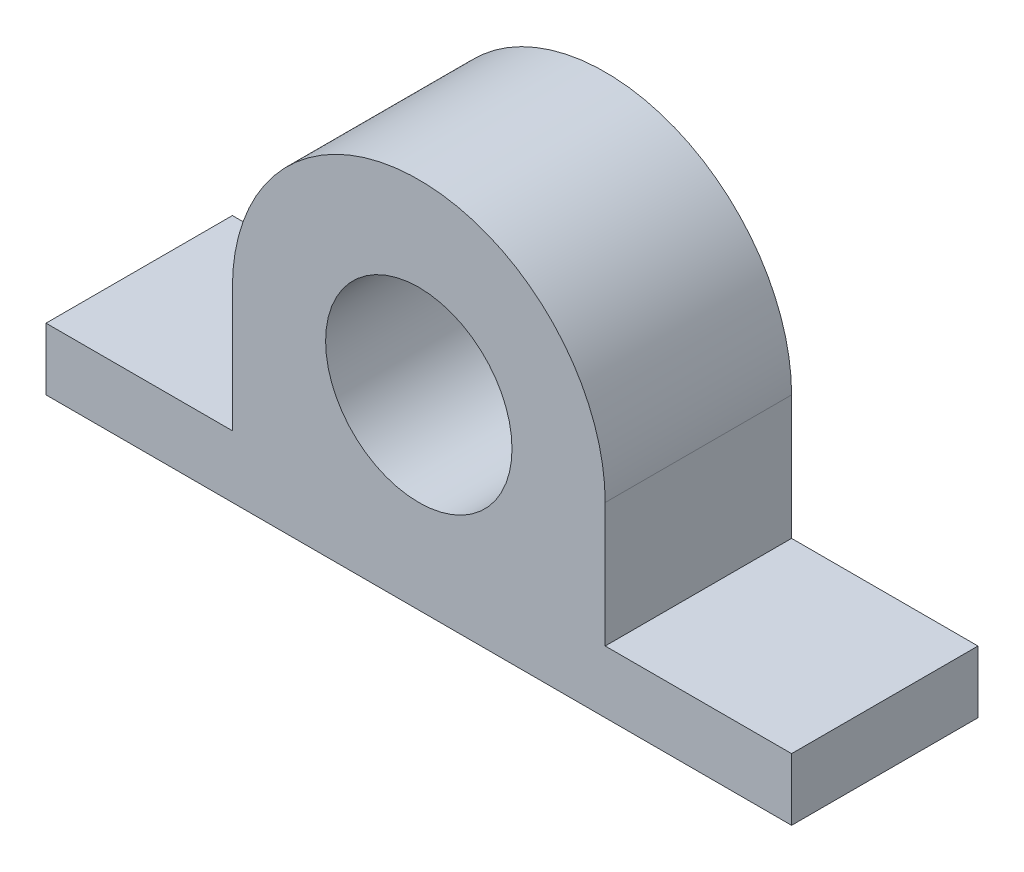
ISO-10303-21;
HEADER;
FILE_DESCRIPTION(('STEP AP214'),'2;1');
FILE_NAME('part.step','',(''),(''),'','','');
FILE_SCHEMA(('AUTOMOTIVE_DESIGN { 1 0 10303 214 1 1 1 1 }'));
ENDSEC;
DATA;
#1=APPLICATION_CONTEXT('core data for automotive mechanical design processes');
#2=APPLICATION_PROTOCOL_DEFINITION('international standard','automotive_design',2000,#1);
#3=PRODUCT_CONTEXT('',#1,'mechanical');
#4=PRODUCT('Part','Part','',(#3));
#5=PRODUCT_RELATED_PRODUCT_CATEGORY('part','',(#4));
#6=PRODUCT_DEFINITION_FORMATION('','',#4);
#7=PRODUCT_DEFINITION_CONTEXT('part definition',#1,'design');
#8=PRODUCT_DEFINITION('design','',#6,#7);
#9=PRODUCT_DEFINITION_SHAPE('','',#8);
#10=(LENGTH_UNIT() NAMED_UNIT(*) SI_UNIT(.MILLI.,.METRE.));
#11=(NAMED_UNIT(*) PLANE_ANGLE_UNIT() SI_UNIT($,.RADIAN.));
#12=(NAMED_UNIT(*) SI_UNIT($,.STERADIAN.) SOLID_ANGLE_UNIT());
#13=UNCERTAINTY_MEASURE_WITH_UNIT(LENGTH_MEASURE(1.E-05),#10,'distance_accuracy_value','');
#14=(GEOMETRIC_REPRESENTATION_CONTEXT(3) GLOBAL_UNCERTAINTY_ASSIGNED_CONTEXT((#13)) GLOBAL_UNIT_ASSIGNED_CONTEXT((#10,
#11,#12)) REPRESENTATION_CONTEXT('',''));
#15=CARTESIAN_POINT('',(0.,0.,0.));
#16=DIRECTION('',(0.,0.,1.));
#17=DIRECTION('',(1.,0.,0.));
#18=AXIS2_PLACEMENT_3D('',#15,#16,#17);
#19=CARTESIAN_POINT('',(30.,0.,30.));
#20=DIRECTION('',(1.,0.,0.));
#21=DIRECTION('',(0.,0.,-1.));
#22=AXIS2_PLACEMENT_3D('',#19,#20,#21);
#23=PLANE('',#22);
#24=DIRECTION('',(0.,-1.,0.));
#25=VECTOR('',#24,1.);
#26=CARTESIAN_POINT('',(30.,0.,0.));
#27=LINE('',#26,#25);
#28=CARTESIAN_POINT('',(30.,25.,0.));
#29=VERTEX_POINT('',#28);
#30=CARTESIAN_POINT('',(30.,5.,0.));
#31=VERTEX_POINT('',#30);
#32=EDGE_CURVE('E137',#29,#31,#27,.T.);
#33=ORIENTED_EDGE('',*,*,#32,.F.);
#34=DIRECTION('',(0.,0.,-1.));
#35=VECTOR('',#34,1.);
#36=CARTESIAN_POINT('',(30.,25.,30.));
#37=LINE('',#36,#35);
#38=CARTESIAN_POINT('',(30.,25.,30.));
#39=VERTEX_POINT('',#38);
#40=EDGE_CURVE('E11',#39,#29,#37,.T.);
#41=ORIENTED_EDGE('',*,*,#40,.F.);
#42=DIRECTION('',(0.,-1.,0.));
#43=VECTOR('',#42,1.);
#44=CARTESIAN_POINT('',(30.,0.,30.));
#45=LINE('',#44,#43);
#46=CARTESIAN_POINT('',(30.,5.,30.));
#47=VERTEX_POINT('',#46);
#48=EDGE_CURVE('E207',#39,#47,#45,.T.);
#49=ORIENTED_EDGE('',*,*,#48,.T.);
#50=DIRECTION('',(0.,0.,-1.));
#51=VECTOR('',#50,1.);
#52=CARTESIAN_POINT('',(30.,5.,30.));
#53=LINE('',#52,#51);
#54=EDGE_CURVE('E87',#47,#31,#53,.T.);
#55=ORIENTED_EDGE('',*,*,#54,.T.);
#56=EDGE_LOOP('',(#33,#41,#49,#55));
#57=FACE_BOUND('',#56,.T.);
#58=ADVANCED_FACE('F35',(#57),#23,.T.);
#59=CARTESIAN_POINT('',(0.,25.,30.));
#60=DIRECTION('',(0.,0.,-1.));
#61=DIRECTION('',(-1.,0.,0.));
#62=AXIS2_PLACEMENT_3D('',#59,#60,#61);
#63=CYLINDRICAL_SURFACE('',#62,30.);
#64=CARTESIAN_POINT('',(0.,25.,0.));
#65=DIRECTION('',(0.,0.,1.));
#66=DIRECTION('',(1.,0.,0.));
#67=AXIS2_PLACEMENT_3D('',#64,#65,#66);
#68=CIRCLE('',#67,30.);
#69=CARTESIAN_POINT('',(-30.,25.,0.));
#70=VERTEX_POINT('',#69);
#71=EDGE_CURVE('E139',#29,#70,#68,.T.);
#72=ORIENTED_EDGE('',*,*,#71,.T.);
#73=DIRECTION('',(0.,0.,-1.));
#74=VECTOR('',#73,1.);
#75=CARTESIAN_POINT('',(-30.,25.,30.));
#76=LINE('',#75,#74);
#77=CARTESIAN_POINT('',(-30.,25.,30.));
#78=VERTEX_POINT('',#77);
#79=EDGE_CURVE('E44',#78,#70,#76,.T.);
#80=ORIENTED_EDGE('',*,*,#79,.F.);
#81=CARTESIAN_POINT('',(0.,25.,30.));
#82=DIRECTION('',(0.,0.,1.));
#83=DIRECTION('',(1.,0.,0.));
#84=AXIS2_PLACEMENT_3D('',#81,#82,#83);
#85=CIRCLE('',#84,30.);
#86=EDGE_CURVE('E209',#39,#78,#85,.T.);
#87=ORIENTED_EDGE('',*,*,#86,.F.);
#88=ORIENTED_EDGE('',*,*,#40,.T.);
#89=EDGE_LOOP('',(#72,#80,#87,#88));
#90=FACE_BOUND('',#89,.T.);
#91=ADVANCED_FACE('F171',(#90),#63,.T.);
#92=CARTESIAN_POINT('',(-30.0000000000001,0.,30.));
#93=DIRECTION('',(1.,0.,0.));
#94=DIRECTION('',(0.,1.,0.));
#95=AXIS2_PLACEMENT_3D('',#92,#93,#94);
#96=PLANE('',#95);
#97=DIRECTION('',(0.,-1.,0.));
#98=VECTOR('',#97,1.);
#99=CARTESIAN_POINT('',(-30.0000000000001,0.,0.));
#100=LINE('',#99,#98);
#101=CARTESIAN_POINT('',(-30.0000000000001,5.,0.));
#102=VERTEX_POINT('',#101);
#103=EDGE_CURVE('E142',#70,#102,#100,.T.);
#104=ORIENTED_EDGE('',*,*,#103,.T.);
#105=DIRECTION('',(0.,0.,-1.));
#106=VECTOR('',#105,1.);
#107=CARTESIAN_POINT('',(-30.0000000000001,5.,30.));
#108=LINE('',#107,#106);
#109=CARTESIAN_POINT('',(-30.0000000000001,5.,30.));
#110=VERTEX_POINT('',#109);
#111=EDGE_CURVE('E161',#110,#102,#108,.T.);
#112=ORIENTED_EDGE('',*,*,#111,.F.);
#113=DIRECTION('',(0.,-1.,0.));
#114=VECTOR('',#113,1.);
#115=CARTESIAN_POINT('',(-30.0000000000001,0.,30.));
#116=LINE('',#115,#114);
#117=EDGE_CURVE('E167',#78,#110,#116,.T.);
#118=ORIENTED_EDGE('',*,*,#117,.F.);
#119=ORIENTED_EDGE('',*,*,#79,.T.);
#120=EDGE_LOOP('',(#104,#112,#118,#119));
#121=FACE_BOUND('',#120,.T.);
#122=ADVANCED_FACE('F165',(#121),#96,.F.);
#123=CARTESIAN_POINT('',(0.,5.,30.));
#124=DIRECTION('',(0.,1.,0.));
#125=DIRECTION('',(-1.,0.,0.));
#126=AXIS2_PLACEMENT_3D('',#123,#124,#125);
#127=PLANE('',#126);
#128=DIRECTION('',(1.,0.,0.));
#129=VECTOR('',#128,1.);
#130=CARTESIAN_POINT('',(0.,5.,0.));
#131=LINE('',#130,#129);
#132=CARTESIAN_POINT('',(-60.0000000000001,4.99999999999999,0.));
#133=VERTEX_POINT('',#132);
#134=EDGE_CURVE('E145',#133,#102,#131,.T.);
#135=ORIENTED_EDGE('',*,*,#134,.F.);
#136=DIRECTION('',(0.,0.,-1.));
#137=VECTOR('',#136,1.);
#138=CARTESIAN_POINT('',(-60.0000000000001,4.99999999999999,30.));
#139=LINE('',#138,#137);
#140=CARTESIAN_POINT('',(-60.0000000000001,4.99999999999999,30.));
#141=VERTEX_POINT('',#140);
#142=EDGE_CURVE('E159',#141,#133,#139,.T.);
#143=ORIENTED_EDGE('',*,*,#142,.F.);
#144=DIRECTION('',(1.,0.,0.));
#145=VECTOR('',#144,1.);
#146=CARTESIAN_POINT('',(0.,5.,30.));
#147=LINE('',#146,#145);
#148=EDGE_CURVE('E129',#141,#110,#147,.T.);
#149=ORIENTED_EDGE('',*,*,#148,.T.);
#150=ORIENTED_EDGE('',*,*,#111,.T.);
#151=EDGE_LOOP('',(#135,#143,#149,#150));
#152=FACE_BOUND('',#151,.T.);
#153=ADVANCED_FACE('F181',(#152),#127,.T.);
#154=CARTESIAN_POINT('',(-60.0000000000001,0.,30.));
#155=DIRECTION('',(-1.,0.,0.));
#156=DIRECTION('',(0.,0.,1.));
#157=AXIS2_PLACEMENT_3D('',#154,#155,#156);
#158=PLANE('',#157);
#159=DIRECTION('',(0.,1.,0.));
#160=VECTOR('',#159,1.);
#161=CARTESIAN_POINT('',(-60.0000000000001,0.,0.));
#162=LINE('',#161,#160);
#163=CARTESIAN_POINT('',(-60.0000000000001,-5.00000000000001,0.));
#164=VERTEX_POINT('',#163);
#165=EDGE_CURVE('E148',#164,#133,#162,.T.);
#166=ORIENTED_EDGE('',*,*,#165,.F.);
#167=DIRECTION('',(0.,0.,-1.));
#168=VECTOR('',#167,1.);
#169=CARTESIAN_POINT('',(-60.0000000000001,-5.00000000000001,30.));
#170=LINE('',#169,#168);
#171=CARTESIAN_POINT('',(-60.0000000000001,-5.00000000000001,30.));
#172=VERTEX_POINT('',#171);
#173=EDGE_CURVE('E116',#172,#164,#170,.T.);
#174=ORIENTED_EDGE('',*,*,#173,.F.);
#175=DIRECTION('',(0.,1.,0.));
#176=VECTOR('',#175,1.);
#177=CARTESIAN_POINT('',(-60.0000000000001,0.,30.));
#178=LINE('',#177,#176);
#179=EDGE_CURVE('E127',#172,#141,#178,.T.);
#180=ORIENTED_EDGE('',*,*,#179,.T.);
#181=ORIENTED_EDGE('',*,*,#142,.T.);
#182=EDGE_LOOP('',(#166,#174,#180,#181));
#183=FACE_BOUND('',#182,.T.);
#184=ADVANCED_FACE('F184',(#183),#158,.T.);
#185=CARTESIAN_POINT('',(0.,-5.,30.));
#186=DIRECTION('',(0.,-1.,0.));
#187=DIRECTION('',(1.,0.,0.));
#188=AXIS2_PLACEMENT_3D('',#185,#186,#187);
#189=PLANE('',#188);
#190=DIRECTION('',(-1.,0.,0.));
#191=VECTOR('',#190,1.);
#192=CARTESIAN_POINT('',(0.,-5.,0.));
#193=LINE('',#192,#191);
#194=CARTESIAN_POINT('',(59.9999999999999,-4.99999999999999,0.));
#195=VERTEX_POINT('',#194);
#196=EDGE_CURVE('E113',#195,#164,#193,.T.);
#197=ORIENTED_EDGE('',*,*,#196,.F.);
#198=DIRECTION('',(0.,0.,-1.));
#199=VECTOR('',#198,1.);
#200=CARTESIAN_POINT('',(59.9999999999999,-4.99999999999999,30.));
#201=LINE('',#200,#199);
#202=CARTESIAN_POINT('',(59.9999999999999,-4.99999999999999,30.));
#203=VERTEX_POINT('',#202);
#204=EDGE_CURVE('E107',#203,#195,#201,.T.);
#205=ORIENTED_EDGE('',*,*,#204,.F.);
#206=DIRECTION('',(-1.,0.,0.));
#207=VECTOR('',#206,1.);
#208=CARTESIAN_POINT('',(0.,-5.,30.));
#209=LINE('',#208,#207);
#210=EDGE_CURVE('E111',#203,#172,#209,.T.);
#211=ORIENTED_EDGE('',*,*,#210,.T.);
#212=ORIENTED_EDGE('',*,*,#173,.T.);
#213=EDGE_LOOP('',(#197,#205,#211,#212));
#214=FACE_BOUND('',#213,.T.);
#215=ADVANCED_FACE('F109',(#214),#189,.T.);
#216=CARTESIAN_POINT('',(59.9999999999999,0.,30.));
#217=DIRECTION('',(-1.,0.,0.));
#218=DIRECTION('',(0.,0.,1.));
#219=AXIS2_PLACEMENT_3D('',#216,#217,#218);
#220=PLANE('',#219);
#221=DIRECTION('',(0.,1.,0.));
#222=VECTOR('',#221,1.);
#223=CARTESIAN_POINT('',(59.9999999999999,0.,0.));
#224=LINE('',#223,#222);
#225=CARTESIAN_POINT('',(59.9999999999999,5.00000000000001,0.));
#226=VERTEX_POINT('',#225);
#227=EDGE_CURVE('E152',#195,#226,#224,.T.);
#228=ORIENTED_EDGE('',*,*,#227,.T.);
#229=DIRECTION('',(0.,0.,-1.));
#230=VECTOR('',#229,1.);
#231=CARTESIAN_POINT('',(59.9999999999999,5.00000000000001,30.));
#232=LINE('',#231,#230);
#233=CARTESIAN_POINT('',(59.9999999999999,5.00000000000001,30.));
#234=VERTEX_POINT('',#233);
#235=EDGE_CURVE('E117',#234,#226,#232,.T.);
#236=ORIENTED_EDGE('',*,*,#235,.F.);
#237=DIRECTION('',(0.,1.,0.));
#238=VECTOR('',#237,1.);
#239=CARTESIAN_POINT('',(59.9999999999999,0.,30.));
#240=LINE('',#239,#238);
#241=EDGE_CURVE('E120',#203,#234,#240,.T.);
#242=ORIENTED_EDGE('',*,*,#241,.F.);
#243=ORIENTED_EDGE('',*,*,#204,.T.);
#244=EDGE_LOOP('',(#228,#236,#242,#243));
#245=FACE_BOUND('',#244,.T.);
#246=ADVANCED_FACE('F121',(#245),#220,.F.);
#247=CARTESIAN_POINT('',(0.,25.,30.));
#248=DIRECTION('',(0.,0.,-1.));
#249=DIRECTION('',(-1.,0.,0.));
#250=AXIS2_PLACEMENT_3D('',#247,#248,#249);
#251=CYLINDRICAL_SURFACE('',#250,15.);
#252=CARTESIAN_POINT('',(0.,25.,30.));
#253=DIRECTION('',(0.,0.,1.));
#254=DIRECTION('',(1.,0.,0.));
#255=AXIS2_PLACEMENT_3D('',#252,#253,#254);
#256=CIRCLE('',#255,15.);
#257=CARTESIAN_POINT('',(15.,25.,30.));
#258=VERTEX_POINT('',#257);
#259=EDGE_CURVE('E155',#258,#258,#256,.T.);
#260=ORIENTED_EDGE('',*,*,#259,.T.);
#261=EDGE_LOOP('',(#260));
#262=FACE_BOUND('',#261,.T.);
#263=CARTESIAN_POINT('',(0.,25.,0.));
#264=DIRECTION('',(0.,0.,1.));
#265=DIRECTION('',(1.,0.,0.));
#266=AXIS2_PLACEMENT_3D('',#263,#264,#265);
#267=CIRCLE('',#266,15.);
#268=CARTESIAN_POINT('',(15.,25.,0.));
#269=VERTEX_POINT('',#268);
#270=EDGE_CURVE('E134',#269,#269,#267,.T.);
#271=ORIENTED_EDGE('',*,*,#270,.F.);
#272=EDGE_LOOP('',(#271));
#273=FACE_BOUND('',#272,.T.);
#274=ADVANCED_FACE('F37',(#262,#273),#251,.F.);
#275=CARTESIAN_POINT('',(0.,5.,30.));
#276=DIRECTION('',(0.,-1.,0.));
#277=DIRECTION('',(1.,0.,0.));
#278=AXIS2_PLACEMENT_3D('',#275,#276,#277);
#279=PLANE('',#278);
#280=DIRECTION('',(-1.,0.,0.));
#281=VECTOR('',#280,1.);
#282=CARTESIAN_POINT('',(0.,5.,0.));
#283=LINE('',#282,#281);
#284=EDGE_CURVE('E80',#226,#31,#283,.T.);
#285=ORIENTED_EDGE('',*,*,#284,.T.);
#286=ORIENTED_EDGE('',*,*,#54,.F.);
#287=DIRECTION('',(-1.,0.,0.));
#288=VECTOR('',#287,1.);
#289=CARTESIAN_POINT('',(0.,5.,30.));
#290=LINE('',#289,#288);
#291=EDGE_CURVE('E52',#234,#47,#290,.T.);
#292=ORIENTED_EDGE('',*,*,#291,.F.);
#293=ORIENTED_EDGE('',*,*,#235,.T.);
#294=EDGE_LOOP('',(#285,#286,#292,#293));
#295=FACE_BOUND('',#294,.T.);
#296=ADVANCED_FACE('F193',(#295),#279,.F.);
#297=CARTESIAN_POINT('',(0.,0.,30.));
#298=DIRECTION('',(0.,0.,1.));
#299=DIRECTION('',(1.,0.,0.));
#300=AXIS2_PLACEMENT_3D('',#297,#298,#299);
#301=PLANE('',#300);
#302=ORIENTED_EDGE('',*,*,#259,.F.);
#303=EDGE_LOOP('',(#302));
#304=FACE_BOUND('',#303,.T.);
#305=ORIENTED_EDGE('',*,*,#48,.F.);
#306=ORIENTED_EDGE('',*,*,#86,.T.);
#307=ORIENTED_EDGE('',*,*,#117,.T.);
#308=ORIENTED_EDGE('',*,*,#148,.F.);
#309=ORIENTED_EDGE('',*,*,#179,.F.);
#310=ORIENTED_EDGE('',*,*,#210,.F.);
#311=ORIENTED_EDGE('',*,*,#241,.T.);
#312=ORIENTED_EDGE('',*,*,#291,.T.);
#313=EDGE_LOOP('',(#305,#306,#307,#308,#309,#310,#311,#312));
#314=FACE_BOUND('',#313,.T.);
#315=ADVANCED_FACE('F124',(#304,#314),#301,.T.);
#316=CARTESIAN_POINT('',(0.,0.,0.));
#317=DIRECTION('',(0.,0.,1.));
#318=DIRECTION('',(1.,0.,0.));
#319=AXIS2_PLACEMENT_3D('',#316,#317,#318);
#320=PLANE('',#319);
#321=ORIENTED_EDGE('',*,*,#270,.T.);
#322=EDGE_LOOP('',(#321));
#323=FACE_BOUND('',#322,.T.);
#324=ORIENTED_EDGE('',*,*,#32,.T.);
#325=ORIENTED_EDGE('',*,*,#284,.F.);
#326=ORIENTED_EDGE('',*,*,#227,.F.);
#327=ORIENTED_EDGE('',*,*,#196,.T.);
#328=ORIENTED_EDGE('',*,*,#165,.T.);
#329=ORIENTED_EDGE('',*,*,#134,.T.);
#330=ORIENTED_EDGE('',*,*,#103,.F.);
#331=ORIENTED_EDGE('',*,*,#71,.F.);
#332=EDGE_LOOP('',(#324,#325,#326,#327,#328,#329,#330,#331));
#333=FACE_BOUND('',#332,.T.);
#334=ADVANCED_FACE('F172',(#323,#333),#320,.F.);
#335=CLOSED_SHELL('',(#58,#91,#122,#153,#184,#215,#246,#274,#296,#315,#334));
#336=MANIFOLD_SOLID_BREP('B2',#335);
#337=ADVANCED_BREP_SHAPE_REPRESENTATION('',(#18,#336),#14);
#338=SHAPE_DEFINITION_REPRESENTATION(#9,#337);
ENDSEC;
END-ISO-10303-21;
